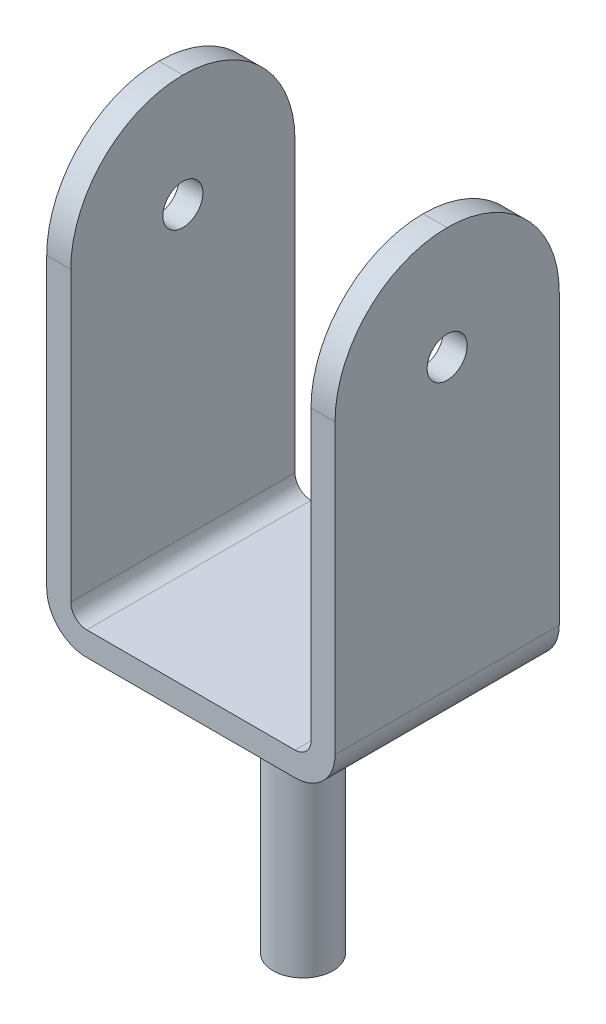
ISO-10303-21;
HEADER;
FILE_DESCRIPTION(('STEP AP214'),'2;1');
FILE_NAME('part.step','',(''),(''),'','','');
FILE_SCHEMA(('AUTOMOTIVE_DESIGN { 1 0 10303 214 1 1 1 1 }'));
ENDSEC;
DATA;
#1=APPLICATION_CONTEXT('core data for automotive mechanical design processes');
#2=APPLICATION_PROTOCOL_DEFINITION('international standard','automotive_design',2000,#1);
#3=PRODUCT_CONTEXT('',#1,'mechanical');
#4=PRODUCT('Part','Part','',(#3));
#5=PRODUCT_RELATED_PRODUCT_CATEGORY('part','',(#4));
#6=PRODUCT_DEFINITION_FORMATION('','',#4);
#7=PRODUCT_DEFINITION_CONTEXT('part definition',#1,'design');
#8=PRODUCT_DEFINITION('design','',#6,#7);
#9=PRODUCT_DEFINITION_SHAPE('','',#8);
#10=(LENGTH_UNIT() NAMED_UNIT(*) SI_UNIT(.MILLI.,.METRE.));
#11=(NAMED_UNIT(*) PLANE_ANGLE_UNIT() SI_UNIT($,.RADIAN.));
#12=(NAMED_UNIT(*) SI_UNIT($,.STERADIAN.) SOLID_ANGLE_UNIT());
#13=UNCERTAINTY_MEASURE_WITH_UNIT(LENGTH_MEASURE(1.E-05),#10,'distance_accuracy_value','');
#14=(GEOMETRIC_REPRESENTATION_CONTEXT(3) GLOBAL_UNCERTAINTY_ASSIGNED_CONTEXT((#13)) GLOBAL_UNIT_ASSIGNED_CONTEXT((#10,
#11,#12)) REPRESENTATION_CONTEXT('',''));
#15=CARTESIAN_POINT('',(0.,0.,0.));
#16=DIRECTION('',(0.,0.,1.));
#17=DIRECTION('',(1.,0.,0.));
#18=AXIS2_PLACEMENT_3D('',#15,#16,#17);
#19=CARTESIAN_POINT('',(-150.,0.,140.));
#20=DIRECTION('',(-1.,0.,0.));
#21=DIRECTION('',(0.,0.,1.));
#22=AXIS2_PLACEMENT_3D('',#19,#20,#21);
#23=PLANE('',#22);
#24=CARTESIAN_POINT('',(-150.,380.,0.));
#25=DIRECTION('',(-1.,0.,0.));
#26=DIRECTION('',(0.,0.,1.));
#27=AXIS2_PLACEMENT_3D('',#24,#25,#26);
#28=CIRCLE('',#27,25.);
#29=CARTESIAN_POINT('',(-150.,380.,-25.));
#30=VERTEX_POINT('',#29);
#31=EDGE_CURVE('E200',#30,#30,#28,.T.);
#32=ORIENTED_EDGE('',*,*,#31,.T.);
#33=EDGE_LOOP('',(#32));
#34=FACE_BOUND('',#33,.T.);
#35=DIRECTION('',(0.,1.,0.));
#36=VECTOR('',#35,1.);
#37=CARTESIAN_POINT('',(-150.,0.,140.));
#38=LINE('',#37,#36);
#39=CARTESIAN_POINT('',(-150.,20.,140.));
#40=VERTEX_POINT('',#39);
#41=CARTESIAN_POINT('',(-150.,380.,140.));
#42=VERTEX_POINT('',#41);
#43=EDGE_CURVE('E139',#40,#42,#38,.T.);
#44=ORIENTED_EDGE('',*,*,#43,.F.);
#45=DIRECTION('',(0.,0.,-1.));
#46=VECTOR('',#45,1.);
#47=CARTESIAN_POINT('',(-150.,20.,-140.));
#48=LINE('',#47,#46);
#49=CARTESIAN_POINT('',(-150.,20.,-140.));
#50=VERTEX_POINT('',#49);
#51=EDGE_CURVE('E212',#40,#50,#48,.T.);
#52=ORIENTED_EDGE('',*,*,#51,.T.);
#53=DIRECTION('',(0.,1.,0.));
#54=VECTOR('',#53,1.);
#55=CARTESIAN_POINT('',(-150.,0.,-140.));
#56=LINE('',#55,#54);
#57=CARTESIAN_POINT('',(-150.,380.,-140.));
#58=VERTEX_POINT('',#57);
#59=EDGE_CURVE('E197',#50,#58,#56,.T.);
#60=ORIENTED_EDGE('',*,*,#59,.T.);
#61=CARTESIAN_POINT('',(-150.,380.,0.));
#62=DIRECTION('',(-1.,0.,0.));
#63=DIRECTION('',(0.,0.,1.));
#64=AXIS2_PLACEMENT_3D('',#61,#62,#63);
#65=CIRCLE('',#64,140.);
#66=CARTESIAN_POINT('',(-150.,520.,0.));
#67=VERTEX_POINT('',#66);
#68=EDGE_CURVE('E156',#58,#67,#65,.F.);
#69=ORIENTED_EDGE('',*,*,#68,.T.);
#70=CARTESIAN_POINT('',(-150.,380.,0.));
#71=DIRECTION('',(-1.,0.,0.));
#72=DIRECTION('',(0.,0.,1.));
#73=AXIS2_PLACEMENT_3D('',#70,#71,#72);
#74=CIRCLE('',#73,140.);
#75=EDGE_CURVE('E154',#67,#42,#74,.F.);
#76=ORIENTED_EDGE('',*,*,#75,.T.);
#77=EDGE_LOOP('',(#44,#52,#60,#69,#76));
#78=FACE_BOUND('',#77,.T.);
#79=ADVANCED_FACE('F37',(#34,#78),#23,.F.);
#80=CARTESIAN_POINT('',(-180.,-30.,140.));
#81=DIRECTION('',(1.,0.,0.));
#82=DIRECTION('',(0.,0.,-1.));
#83=AXIS2_PLACEMENT_3D('',#80,#81,#82);
#84=PLANE('',#83);
#85=CARTESIAN_POINT('',(-180.,380.,0.));
#86=DIRECTION('',(1.,0.,0.));
#87=DIRECTION('',(0.,0.,-1.));
#88=AXIS2_PLACEMENT_3D('',#85,#86,#87);
#89=CIRCLE('',#88,25.);
#90=CARTESIAN_POINT('',(-180.,380.,-25.));
#91=VERTEX_POINT('',#90);
#92=EDGE_CURVE('E204',#91,#91,#89,.T.);
#93=ORIENTED_EDGE('',*,*,#92,.T.);
#94=EDGE_LOOP('',(#93));
#95=FACE_BOUND('',#94,.T.);
#96=DIRECTION('',(0.,-1.,0.));
#97=VECTOR('',#96,1.);
#98=CARTESIAN_POINT('',(-180.,-30.,-140.));
#99=LINE('',#98,#97);
#100=CARTESIAN_POINT('',(-180.,380.,-140.));
#101=VERTEX_POINT('',#100);
#102=CARTESIAN_POINT('',(-180.,20.,-140.));
#103=VERTEX_POINT('',#102);
#104=EDGE_CURVE('E247',#101,#103,#99,.T.);
#105=ORIENTED_EDGE('',*,*,#104,.T.);
#106=DIRECTION('',(0.,0.,-1.));
#107=VECTOR('',#106,1.);
#108=CARTESIAN_POINT('',(-180.,20.,140.));
#109=LINE('',#108,#107);
#110=CARTESIAN_POINT('',(-180.,20.,140.));
#111=VERTEX_POINT('',#110);
#112=EDGE_CURVE('E60',#103,#111,#109,.F.);
#113=ORIENTED_EDGE('',*,*,#112,.T.);
#114=DIRECTION('',(0.,-1.,0.));
#115=VECTOR('',#114,1.);
#116=CARTESIAN_POINT('',(-180.,-30.,140.));
#117=LINE('',#116,#115);
#118=CARTESIAN_POINT('',(-180.,380.,140.));
#119=VERTEX_POINT('',#118);
#120=EDGE_CURVE('E150',#119,#111,#117,.T.);
#121=ORIENTED_EDGE('',*,*,#120,.F.);
#122=CARTESIAN_POINT('',(-180.,380.,0.));
#123=DIRECTION('',(1.,0.,0.));
#124=DIRECTION('',(0.,0.,-1.));
#125=AXIS2_PLACEMENT_3D('',#122,#123,#124);
#126=CIRCLE('',#125,140.);
#127=CARTESIAN_POINT('',(-180.,520.,0.));
#128=VERTEX_POINT('',#127);
#129=EDGE_CURVE('E164',#119,#128,#126,.F.);
#130=ORIENTED_EDGE('',*,*,#129,.T.);
#131=CARTESIAN_POINT('',(-180.,380.,0.));
#132=DIRECTION('',(1.,0.,0.));
#133=DIRECTION('',(0.,0.,-1.));
#134=AXIS2_PLACEMENT_3D('',#131,#132,#133);
#135=CIRCLE('',#134,140.);
#136=EDGE_CURVE('E160',#128,#101,#135,.F.);
#137=ORIENTED_EDGE('',*,*,#136,.T.);
#138=EDGE_LOOP('',(#105,#113,#121,#130,#137));
#139=FACE_BOUND('',#138,.T.);
#140=ADVANCED_FACE('F250',(#95,#139),#84,.F.);
#141=CARTESIAN_POINT('',(-180.,-30.,140.));
#142=DIRECTION('',(0.,1.,0.));
#143=DIRECTION('',(0.,0.,1.));
#144=AXIS2_PLACEMENT_3D('',#141,#142,#143);
#145=PLANE('',#144);
#146=CARTESIAN_POINT('',(0.,-30.,0.));
#147=DIRECTION('',(0.,-1.,0.));
#148=DIRECTION('',(0.,0.,-1.));
#149=AXIS2_PLACEMENT_3D('',#146,#147,#148);
#150=CIRCLE('',#149,37.5);
#151=CARTESIAN_POINT('',(0.,-30.,-37.5));
#152=VERTEX_POINT('',#151);
#153=EDGE_CURVE('E193',#152,#152,#150,.T.);
#154=ORIENTED_EDGE('',*,*,#153,.F.);
#155=EDGE_LOOP('',(#154));
#156=FACE_BOUND('',#155,.T.);
#157=DIRECTION('',(1.,0.,0.));
#158=VECTOR('',#157,1.);
#159=CARTESIAN_POINT('',(-180.,-30.,140.));
#160=LINE('',#159,#158);
#161=CARTESIAN_POINT('',(-130.,-30.,140.));
#162=VERTEX_POINT('',#161);
#163=CARTESIAN_POINT('',(130.,-30.,140.));
#164=VERTEX_POINT('',#163);
#165=EDGE_CURVE('E233',#162,#164,#160,.T.);
#166=ORIENTED_EDGE('',*,*,#165,.F.);
#167=DIRECTION('',(0.,0.,-1.));
#168=VECTOR('',#167,1.);
#169=CARTESIAN_POINT('',(-130.,-30.,140.));
#170=LINE('',#169,#168);
#171=CARTESIAN_POINT('',(-130.,-30.,-140.));
#172=VERTEX_POINT('',#171);
#173=EDGE_CURVE('E223',#162,#172,#170,.T.);
#174=ORIENTED_EDGE('',*,*,#173,.T.);
#175=DIRECTION('',(1.,0.,0.));
#176=VECTOR('',#175,1.);
#177=CARTESIAN_POINT('',(-180.,-30.,-140.));
#178=LINE('',#177,#176);
#179=CARTESIAN_POINT('',(130.,-30.,-140.));
#180=VERTEX_POINT('',#179);
#181=EDGE_CURVE('E249',#172,#180,#178,.T.);
#182=ORIENTED_EDGE('',*,*,#181,.T.);
#183=DIRECTION('',(0.,0.,-1.));
#184=VECTOR('',#183,1.);
#185=CARTESIAN_POINT('',(130.,-30.,140.));
#186=LINE('',#185,#184);
#187=EDGE_CURVE('E221',#180,#164,#186,.F.);
#188=ORIENTED_EDGE('',*,*,#187,.T.);
#189=EDGE_LOOP('',(#166,#174,#182,#188));
#190=FACE_BOUND('',#189,.T.);
#191=ADVANCED_FACE('F237',(#156,#190),#145,.F.);
#192=CARTESIAN_POINT('',(180.,-30.,140.));
#193=DIRECTION('',(-1.,0.,0.));
#194=DIRECTION('',(0.,0.,1.));
#195=AXIS2_PLACEMENT_3D('',#192,#193,#194);
#196=PLANE('',#195);
#197=CARTESIAN_POINT('',(180.,380.,0.));
#198=DIRECTION('',(1.,0.,0.));
#199=DIRECTION('',(0.,0.,-1.));
#200=AXIS2_PLACEMENT_3D('',#197,#198,#199);
#201=CIRCLE('',#200,25.);
#202=CARTESIAN_POINT('',(180.,380.,-25.));
#203=VERTEX_POINT('',#202);
#204=EDGE_CURVE('E328',#203,#203,#201,.T.);
#205=ORIENTED_EDGE('',*,*,#204,.F.);
#206=EDGE_LOOP('',(#205));
#207=FACE_BOUND('',#206,.T.);
#208=DIRECTION('',(0.,1.,0.));
#209=VECTOR('',#208,1.);
#210=CARTESIAN_POINT('',(180.,-30.,140.));
#211=LINE('',#210,#209);
#212=CARTESIAN_POINT('',(180.,20.,140.));
#213=VERTEX_POINT('',#212);
#214=CARTESIAN_POINT('',(180.,380.,140.));
#215=VERTEX_POINT('',#214);
#216=EDGE_CURVE('E241',#213,#215,#211,.T.);
#217=ORIENTED_EDGE('',*,*,#216,.F.);
#218=DIRECTION('',(0.,0.,-1.));
#219=VECTOR('',#218,1.);
#220=CARTESIAN_POINT('',(180.,20.,140.));
#221=LINE('',#220,#219);
#222=CARTESIAN_POINT('',(180.,20.,-140.));
#223=VERTEX_POINT('',#222);
#224=EDGE_CURVE('E11',#213,#223,#221,.T.);
#225=ORIENTED_EDGE('',*,*,#224,.T.);
#226=DIRECTION('',(0.,1.,0.));
#227=VECTOR('',#226,1.);
#228=CARTESIAN_POINT('',(180.,-30.,-140.));
#229=LINE('',#228,#227);
#230=CARTESIAN_POINT('',(180.,380.,-140.));
#231=VERTEX_POINT('',#230);
#232=EDGE_CURVE('E253',#223,#231,#229,.T.);
#233=ORIENTED_EDGE('',*,*,#232,.T.);
#234=CARTESIAN_POINT('',(180.,380.,0.));
#235=DIRECTION('',(-1.,0.,0.));
#236=DIRECTION('',(0.,0.,1.));
#237=AXIS2_PLACEMENT_3D('',#234,#235,#236);
#238=CIRCLE('',#237,140.);
#239=CARTESIAN_POINT('',(180.,520.,0.));
#240=VERTEX_POINT('',#239);
#241=EDGE_CURVE('E179',#231,#240,#238,.F.);
#242=ORIENTED_EDGE('',*,*,#241,.T.);
#243=CARTESIAN_POINT('',(180.,380.,0.));
#244=DIRECTION('',(-1.,0.,0.));
#245=DIRECTION('',(0.,0.,1.));
#246=AXIS2_PLACEMENT_3D('',#243,#244,#245);
#247=CIRCLE('',#246,140.);
#248=EDGE_CURVE('E181',#240,#215,#247,.F.);
#249=ORIENTED_EDGE('',*,*,#248,.T.);
#250=EDGE_LOOP('',(#217,#225,#233,#242,#249));
#251=FACE_BOUND('',#250,.T.);
#252=ADVANCED_FACE('F314',(#207,#251),#196,.F.);
#253=CARTESIAN_POINT('',(150.,0.,140.));
#254=DIRECTION('',(1.,0.,0.));
#255=DIRECTION('',(0.,0.,-1.));
#256=AXIS2_PLACEMENT_3D('',#253,#254,#255);
#257=PLANE('',#256);
#258=CARTESIAN_POINT('',(150.,380.,0.));
#259=DIRECTION('',(1.,0.,0.));
#260=DIRECTION('',(0.,0.,-1.));
#261=AXIS2_PLACEMENT_3D('',#258,#259,#260);
#262=CIRCLE('',#261,25.);
#263=CARTESIAN_POINT('',(150.,380.,-25.));
#264=VERTEX_POINT('',#263);
#265=EDGE_CURVE('E201',#264,#264,#262,.T.);
#266=ORIENTED_EDGE('',*,*,#265,.T.);
#267=EDGE_LOOP('',(#266));
#268=FACE_BOUND('',#267,.T.);
#269=DIRECTION('',(0.,-1.,0.));
#270=VECTOR('',#269,1.);
#271=CARTESIAN_POINT('',(150.,0.,-140.));
#272=LINE('',#271,#270);
#273=CARTESIAN_POINT('',(150.,380.,-140.));
#274=VERTEX_POINT('',#273);
#275=CARTESIAN_POINT('',(150.,20.,-140.));
#276=VERTEX_POINT('',#275);
#277=EDGE_CURVE('E257',#274,#276,#272,.T.);
#278=ORIENTED_EDGE('',*,*,#277,.T.);
#279=DIRECTION('',(0.,0.,-1.));
#280=VECTOR('',#279,1.);
#281=CARTESIAN_POINT('',(150.,20.,140.));
#282=LINE('',#281,#280);
#283=CARTESIAN_POINT('',(150.,20.,140.));
#284=VERTEX_POINT('',#283);
#285=EDGE_CURVE('E210',#276,#284,#282,.F.);
#286=ORIENTED_EDGE('',*,*,#285,.T.);
#287=DIRECTION('',(0.,-1.,0.));
#288=VECTOR('',#287,1.);
#289=CARTESIAN_POINT('',(150.,0.,140.));
#290=LINE('',#289,#288);
#291=CARTESIAN_POINT('',(150.,380.,140.));
#292=VERTEX_POINT('',#291);
#293=EDGE_CURVE('E171',#292,#284,#290,.T.);
#294=ORIENTED_EDGE('',*,*,#293,.F.);
#295=CARTESIAN_POINT('',(150.,380.,0.));
#296=DIRECTION('',(1.,0.,0.));
#297=DIRECTION('',(0.,0.,-1.));
#298=AXIS2_PLACEMENT_3D('',#295,#296,#297);
#299=CIRCLE('',#298,140.);
#300=CARTESIAN_POINT('',(150.,520.,0.));
#301=VERTEX_POINT('',#300);
#302=EDGE_CURVE('E177',#292,#301,#299,.F.);
#303=ORIENTED_EDGE('',*,*,#302,.T.);
#304=CARTESIAN_POINT('',(150.,380.,0.));
#305=DIRECTION('',(1.,0.,0.));
#306=DIRECTION('',(0.,0.,-1.));
#307=AXIS2_PLACEMENT_3D('',#304,#305,#306);
#308=CIRCLE('',#307,140.);
#309=EDGE_CURVE('E169',#301,#274,#308,.F.);
#310=ORIENTED_EDGE('',*,*,#309,.T.);
#311=EDGE_LOOP('',(#278,#286,#294,#303,#310));
#312=FACE_BOUND('',#311,.T.);
#313=ADVANCED_FACE('F322',(#268,#312),#257,.F.);
#314=CARTESIAN_POINT('',(-150.,0.,140.));
#315=DIRECTION('',(0.,-1.,0.));
#316=DIRECTION('',(0.,0.,-1.));
#317=AXIS2_PLACEMENT_3D('',#314,#315,#316);
#318=PLANE('',#317);
#319=DIRECTION('',(-1.,0.,0.));
#320=VECTOR('',#319,1.);
#321=CARTESIAN_POINT('',(-150.,0.,140.));
#322=LINE('',#321,#320);
#323=CARTESIAN_POINT('',(130.,0.,140.));
#324=VERTEX_POINT('',#323);
#325=CARTESIAN_POINT('',(-130.,0.,140.));
#326=VERTEX_POINT('',#325);
#327=EDGE_CURVE('E166',#324,#326,#322,.T.);
#328=ORIENTED_EDGE('',*,*,#327,.F.);
#329=DIRECTION('',(0.,0.,-1.));
#330=VECTOR('',#329,1.);
#331=CARTESIAN_POINT('',(130.,0.,-140.));
#332=LINE('',#331,#330);
#333=CARTESIAN_POINT('',(130.,0.,-140.));
#334=VERTEX_POINT('',#333);
#335=EDGE_CURVE('E207',#324,#334,#332,.T.);
#336=ORIENTED_EDGE('',*,*,#335,.T.);
#337=DIRECTION('',(-1.,0.,0.));
#338=VECTOR('',#337,1.);
#339=CARTESIAN_POINT('',(-150.,0.,-140.));
#340=LINE('',#339,#338);
#341=CARTESIAN_POINT('',(-130.,0.,-140.));
#342=VERTEX_POINT('',#341);
#343=EDGE_CURVE('E151',#334,#342,#340,.T.);
#344=ORIENTED_EDGE('',*,*,#343,.T.);
#345=DIRECTION('',(0.,0.,-1.));
#346=VECTOR('',#345,1.);
#347=CARTESIAN_POINT('',(-130.,0.,140.));
#348=LINE('',#347,#346);
#349=EDGE_CURVE('E205',#342,#326,#348,.F.);
#350=ORIENTED_EDGE('',*,*,#349,.T.);
#351=EDGE_LOOP('',(#328,#336,#344,#350));
#352=FACE_BOUND('',#351,.T.);
#353=ADVANCED_FACE('F267',(#352),#318,.F.);
#354=CARTESIAN_POINT('',(0.,0.,140.));
#355=DIRECTION('',(0.,0.,-1.));
#356=DIRECTION('',(-1.,0.,0.));
#357=AXIS2_PLACEMENT_3D('',#354,#355,#356);
#358=PLANE('',#357);
#359=ORIENTED_EDGE('',*,*,#120,.T.);
#360=CARTESIAN_POINT('',(-130.,20.,140.));
#361=DIRECTION('',(0.,0.,-1.));
#362=DIRECTION('',(-1.,0.,0.));
#363=AXIS2_PLACEMENT_3D('',#360,#361,#362);
#364=CIRCLE('',#363,50.);
#365=EDGE_CURVE('E45',#111,#162,#364,.F.);
#366=ORIENTED_EDGE('',*,*,#365,.T.);
#367=ORIENTED_EDGE('',*,*,#165,.T.);
#368=CARTESIAN_POINT('',(130.,20.,140.));
#369=DIRECTION('',(0.,0.,-1.));
#370=DIRECTION('',(-1.,0.,0.));
#371=AXIS2_PLACEMENT_3D('',#368,#369,#370);
#372=CIRCLE('',#371,50.);
#373=EDGE_CURVE('E52',#164,#213,#372,.F.);
#374=ORIENTED_EDGE('',*,*,#373,.T.);
#375=ORIENTED_EDGE('',*,*,#216,.T.);
#376=DIRECTION('',(-1.,0.,0.));
#377=VECTOR('',#376,1.);
#378=CARTESIAN_POINT('',(0.,380.,140.));
#379=LINE('',#378,#377);
#380=EDGE_CURVE('E165',#215,#292,#379,.T.);
#381=ORIENTED_EDGE('',*,*,#380,.T.);
#382=ORIENTED_EDGE('',*,*,#293,.T.);
#383=CARTESIAN_POINT('',(130.,20.,140.));
#384=DIRECTION('',(0.,0.,-1.));
#385=DIRECTION('',(-1.,0.,0.));
#386=AXIS2_PLACEMENT_3D('',#383,#384,#385);
#387=CIRCLE('',#386,20.);
#388=EDGE_CURVE('E216',#284,#324,#387,.T.);
#389=ORIENTED_EDGE('',*,*,#388,.T.);
#390=ORIENTED_EDGE('',*,*,#327,.T.);
#391=CARTESIAN_POINT('',(-130.,20.,140.));
#392=DIRECTION('',(0.,0.,-1.));
#393=DIRECTION('',(-1.,0.,0.));
#394=AXIS2_PLACEMENT_3D('',#391,#392,#393);
#395=CIRCLE('',#394,20.);
#396=EDGE_CURVE('E146',#326,#40,#395,.T.);
#397=ORIENTED_EDGE('',*,*,#396,.T.);
#398=ORIENTED_EDGE('',*,*,#43,.T.);
#399=DIRECTION('',(-1.,0.,0.));
#400=VECTOR('',#399,1.);
#401=CARTESIAN_POINT('',(0.,380.,140.));
#402=LINE('',#401,#400);
#403=EDGE_CURVE('E143',#42,#119,#402,.T.);
#404=ORIENTED_EDGE('',*,*,#403,.T.);
#405=EDGE_LOOP('',(#359,#366,#367,#374,#375,#381,#382,#389,#390,#397,#398,#404));
#406=FACE_BOUND('',#405,.T.);
#407=ADVANCED_FACE('F141',(#406),#358,.F.);
#408=CARTESIAN_POINT('',(0.,0.,-140.));
#409=DIRECTION('',(0.,0.,-1.));
#410=DIRECTION('',(-1.,0.,0.));
#411=AXIS2_PLACEMENT_3D('',#408,#409,#410);
#412=PLANE('',#411);
#413=ORIENTED_EDGE('',*,*,#181,.F.);
#414=CARTESIAN_POINT('',(-130.,20.,-140.));
#415=DIRECTION('',(0.,0.,-1.));
#416=DIRECTION('',(-1.,0.,0.));
#417=AXIS2_PLACEMENT_3D('',#414,#415,#416);
#418=CIRCLE('',#417,50.);
#419=EDGE_CURVE('E228',#172,#103,#418,.T.);
#420=ORIENTED_EDGE('',*,*,#419,.T.);
#421=ORIENTED_EDGE('',*,*,#104,.F.);
#422=DIRECTION('',(-1.,0.,0.));
#423=VECTOR('',#422,1.);
#424=CARTESIAN_POINT('',(-150.,380.,-140.));
#425=LINE('',#424,#423);
#426=EDGE_CURVE('E184',#101,#58,#425,.F.);
#427=ORIENTED_EDGE('',*,*,#426,.T.);
#428=ORIENTED_EDGE('',*,*,#59,.F.);
#429=CARTESIAN_POINT('',(-130.,20.,-140.));
#430=DIRECTION('',(0.,0.,-1.));
#431=DIRECTION('',(-1.,0.,0.));
#432=AXIS2_PLACEMENT_3D('',#429,#430,#431);
#433=CIRCLE('',#432,20.);
#434=EDGE_CURVE('E218',#50,#342,#433,.F.);
#435=ORIENTED_EDGE('',*,*,#434,.T.);
#436=ORIENTED_EDGE('',*,*,#343,.F.);
#437=CARTESIAN_POINT('',(130.,20.,-140.));
#438=DIRECTION('',(0.,0.,-1.));
#439=DIRECTION('',(-1.,0.,0.));
#440=AXIS2_PLACEMENT_3D('',#437,#438,#439);
#441=CIRCLE('',#440,20.);
#442=EDGE_CURVE('E214',#334,#276,#441,.F.);
#443=ORIENTED_EDGE('',*,*,#442,.T.);
#444=ORIENTED_EDGE('',*,*,#277,.F.);
#445=DIRECTION('',(-1.,0.,0.));
#446=VECTOR('',#445,1.);
#447=CARTESIAN_POINT('',(180.,380.,-140.));
#448=LINE('',#447,#446);
#449=EDGE_CURVE('E187',#274,#231,#448,.F.);
#450=ORIENTED_EDGE('',*,*,#449,.T.);
#451=ORIENTED_EDGE('',*,*,#232,.F.);
#452=CARTESIAN_POINT('',(130.,20.,-140.));
#453=DIRECTION('',(0.,0.,-1.));
#454=DIRECTION('',(-1.,0.,0.));
#455=AXIS2_PLACEMENT_3D('',#452,#453,#454);
#456=CIRCLE('',#455,50.);
#457=EDGE_CURVE('E226',#223,#180,#456,.T.);
#458=ORIENTED_EDGE('',*,*,#457,.T.);
#459=EDGE_LOOP('',(#413,#420,#421,#427,#428,#435,#436,#443,#444,#450,#451,#458));
#460=FACE_BOUND('',#459,.T.);
#461=ADVANCED_FACE('F246',(#460),#412,.T.);
#462=CARTESIAN_POINT('',(150.,380.,0.));
#463=DIRECTION('',(1.,0.,0.));
#464=DIRECTION('',(0.,0.,-1.));
#465=AXIS2_PLACEMENT_3D('',#462,#463,#464);
#466=CYLINDRICAL_SURFACE('',#465,140.);
#467=DIRECTION('',(-1.,0.,0.));
#468=VECTOR('',#467,1.);
#469=CARTESIAN_POINT('',(150.,520.,0.));
#470=LINE('',#469,#468);
#471=EDGE_CURVE('E194',#240,#301,#470,.T.);
#472=ORIENTED_EDGE('',*,*,#471,.F.);
#473=ORIENTED_EDGE('',*,*,#241,.F.);
#474=ORIENTED_EDGE('',*,*,#449,.F.);
#475=ORIENTED_EDGE('',*,*,#309,.F.);
#476=EDGE_LOOP('',(#472,#473,#474,#475));
#477=FACE_BOUND('',#476,.T.);
#478=ADVANCED_FACE('F299',(#477),#466,.T.);
#479=CARTESIAN_POINT('',(0.,380.,0.));
#480=DIRECTION('',(-1.,0.,0.));
#481=DIRECTION('',(0.,0.,1.));
#482=AXIS2_PLACEMENT_3D('',#479,#480,#481);
#483=CYLINDRICAL_SURFACE('',#482,140.);
#484=ORIENTED_EDGE('',*,*,#248,.F.);
#485=ORIENTED_EDGE('',*,*,#471,.T.);
#486=ORIENTED_EDGE('',*,*,#302,.F.);
#487=ORIENTED_EDGE('',*,*,#380,.F.);
#488=EDGE_LOOP('',(#484,#485,#486,#487));
#489=FACE_BOUND('',#488,.T.);
#490=ADVANCED_FACE('F284',(#489),#483,.T.);
#491=CARTESIAN_POINT('',(0.,380.,0.));
#492=DIRECTION('',(-1.,0.,0.));
#493=DIRECTION('',(0.,0.,1.));
#494=AXIS2_PLACEMENT_3D('',#491,#492,#493);
#495=CYLINDRICAL_SURFACE('',#494,140.);
#496=ORIENTED_EDGE('',*,*,#403,.F.);
#497=ORIENTED_EDGE('',*,*,#75,.F.);
#498=DIRECTION('',(-1.,0.,0.));
#499=VECTOR('',#498,1.);
#500=CARTESIAN_POINT('',(-180.,520.,0.));
#501=LINE('',#500,#499);
#502=EDGE_CURVE('E198',#128,#67,#501,.F.);
#503=ORIENTED_EDGE('',*,*,#502,.F.);
#504=ORIENTED_EDGE('',*,*,#129,.F.);
#505=EDGE_LOOP('',(#496,#497,#503,#504));
#506=FACE_BOUND('',#505,.T.);
#507=ADVANCED_FACE('F163',(#506),#495,.T.);
#508=CARTESIAN_POINT('',(-180.,380.,0.));
#509=DIRECTION('',(1.,0.,0.));
#510=DIRECTION('',(0.,0.,-1.));
#511=AXIS2_PLACEMENT_3D('',#508,#509,#510);
#512=CYLINDRICAL_SURFACE('',#511,140.);
#513=ORIENTED_EDGE('',*,*,#68,.F.);
#514=ORIENTED_EDGE('',*,*,#426,.F.);
#515=ORIENTED_EDGE('',*,*,#136,.F.);
#516=ORIENTED_EDGE('',*,*,#502,.T.);
#517=EDGE_LOOP('',(#513,#514,#515,#516));
#518=FACE_BOUND('',#517,.T.);
#519=ADVANCED_FACE('F273',(#518),#512,.T.);
#520=CARTESIAN_POINT('',(-180.,380.,0.));
#521=DIRECTION('',(1.,0.,0.));
#522=DIRECTION('',(0.,0.,-1.));
#523=AXIS2_PLACEMENT_3D('',#520,#521,#522);
#524=CYLINDRICAL_SURFACE('',#523,25.);
#525=CARTESIAN_POINT('',(180.,380.,-25.));
#526=CARTESIAN_POINT('',(179.6875,380.,-25.));
#527=CARTESIAN_POINT('',(179.375,380.,-25.));
#528=CARTESIAN_POINT('',(178.75,380.,-25.));
#529=CARTESIAN_POINT('',(178.4375,380.,-25.));
#530=CARTESIAN_POINT('',(177.8125,380.,-25.));
#531=CARTESIAN_POINT('',(177.5,380.,-25.));
#532=CARTESIAN_POINT('',(176.875,380.,-25.));
#533=CARTESIAN_POINT('',(176.5625,380.,-25.));
#534=CARTESIAN_POINT('',(175.9375,380.,-25.));
#535=CARTESIAN_POINT('',(175.625,380.,-25.));
#536=CARTESIAN_POINT('',(175.,380.,-25.));
#537=CARTESIAN_POINT('',(174.6875,380.,-25.));
#538=CARTESIAN_POINT('',(174.0625,380.,-25.));
#539=CARTESIAN_POINT('',(173.75,380.,-25.));
#540=CARTESIAN_POINT('',(173.125,380.,-25.));
#541=CARTESIAN_POINT('',(172.8125,380.,-25.));
#542=CARTESIAN_POINT('',(172.1875,380.,-25.));
#543=CARTESIAN_POINT('',(171.875,380.,-25.));
#544=CARTESIAN_POINT('',(171.25,380.,-25.));
#545=CARTESIAN_POINT('',(170.9375,380.,-25.));
#546=CARTESIAN_POINT('',(170.3125,380.,-25.));
#547=CARTESIAN_POINT('',(170.,380.,-25.));
#548=CARTESIAN_POINT('',(169.375,380.,-25.));
#549=CARTESIAN_POINT('',(169.0625,380.,-25.));
#550=CARTESIAN_POINT('',(168.4375,380.,-25.));
#551=CARTESIAN_POINT('',(168.125,380.,-25.));
#552=CARTESIAN_POINT('',(167.5,380.,-25.));
#553=CARTESIAN_POINT('',(167.1875,380.,-25.));
#554=CARTESIAN_POINT('',(166.5625,380.,-25.));
#555=CARTESIAN_POINT('',(166.25,380.,-25.));
#556=CARTESIAN_POINT('',(165.625,380.,-25.));
#557=CARTESIAN_POINT('',(165.3125,380.,-25.));
#558=CARTESIAN_POINT('',(164.6875,380.,-25.));
#559=CARTESIAN_POINT('',(164.375,380.,-25.));
#560=CARTESIAN_POINT('',(163.75,380.,-25.));
#561=CARTESIAN_POINT('',(163.4375,380.,-25.));
#562=CARTESIAN_POINT('',(162.8125,380.,-25.));
#563=CARTESIAN_POINT('',(162.5,380.,-25.));
#564=CARTESIAN_POINT('',(161.875,380.,-25.));
#565=CARTESIAN_POINT('',(161.5625,380.,-25.));
#566=CARTESIAN_POINT('',(160.9375,380.,-25.));
#567=CARTESIAN_POINT('',(160.625,380.,-25.));
#568=CARTESIAN_POINT('',(160.,380.,-25.));
#569=CARTESIAN_POINT('',(159.6875,380.,-25.));
#570=CARTESIAN_POINT('',(159.0625,380.,-25.));
#571=CARTESIAN_POINT('',(158.75,380.,-25.));
#572=CARTESIAN_POINT('',(158.125,380.,-25.));
#573=CARTESIAN_POINT('',(157.8125,380.,-25.));
#574=CARTESIAN_POINT('',(157.1875,380.,-25.));
#575=CARTESIAN_POINT('',(156.875,380.,-25.));
#576=CARTESIAN_POINT('',(156.25,380.,-25.));
#577=CARTESIAN_POINT('',(155.9375,380.,-25.));
#578=CARTESIAN_POINT('',(155.3125,380.,-25.));
#579=CARTESIAN_POINT('',(155.,380.,-25.));
#580=CARTESIAN_POINT('',(154.375,380.,-25.));
#581=CARTESIAN_POINT('',(154.0625,380.,-25.));
#582=CARTESIAN_POINT('',(153.4375,380.,-25.));
#583=CARTESIAN_POINT('',(153.125,380.,-25.));
#584=CARTESIAN_POINT('',(152.5,380.,-25.));
#585=CARTESIAN_POINT('',(152.1875,380.,-25.));
#586=CARTESIAN_POINT('',(151.5625,380.,-25.));
#587=CARTESIAN_POINT('',(151.25,380.,-25.));
#588=CARTESIAN_POINT('',(150.625,380.,-25.));
#589=CARTESIAN_POINT('',(150.3125,380.,-25.));
#590=CARTESIAN_POINT('',(150.,380.,-25.));
#591=B_SPLINE_CURVE_WITH_KNOTS('',3,(#525,#526,#527,#528,#529,#530,#531,#532,#533,#534,#535,
#536,#537,#538,#539,#540,#541,#542,#543,#544,#545,#546,#547,#548,#549,#550,#551,#552,#553,#554,
#555,#556,#557,#558,#559,#560,#561,#562,#563,#564,#565,#566,#567,#568,#569,#570,#571,#572,#573,
#574,#575,#576,#577,#578,#579,#580,#581,#582,#583,#584,#585,#586,#587,#588,#589,#590),
.UNSPECIFIED.,.F.,.F.,(4,2,2,2,2,2,2,2,2,2,2,2,2,2,2,2,2,2,2,2,2,2,2,2,2,2,2,2,2,2,2,2,4),(0.,
0.93749999999998,1.87500000000002,2.8125,3.75000000000003,4.68750000000001,5.62499999999999,
6.56250000000003,7.50000000000001,8.43749999999999,9.37500000000002,10.3125,11.25,12.1875,
13.125,14.0625,15.,15.9375,16.875,17.8125,18.75,19.6875,20.625,21.5625,22.5,23.4375,24.375,
25.3125,26.25,27.1875,28.125,29.0625,30.),.UNSPECIFIED.);
#592=EDGE_CURVE('BSEAM275',#203,#264,#591,.T.);
#593=ORIENTED_EDGE('',*,*,#204,.T.);
#594=ORIENTED_EDGE('',*,*,#265,.F.);
#595=ORIENTED_EDGE('',*,*,#592,.T.);
#596=ORIENTED_EDGE('',*,*,#592,.F.);
#597=EDGE_LOOP('',(#593,#595,#594,#596));
#598=FACE_BOUND('',#597,.T.);
#599=ADVANCED_FACE('F275',(#598),#524,.F.);
#600=CARTESIAN_POINT('',(-180.,380.,-25.));
#601=CARTESIAN_POINT('',(-179.6875,380.,-25.));
#602=CARTESIAN_POINT('',(-179.375,380.,-25.));
#603=CARTESIAN_POINT('',(-178.75,380.,-25.));
#604=CARTESIAN_POINT('',(-178.4375,380.,-25.));
#605=CARTESIAN_POINT('',(-177.8125,380.,-25.));
#606=CARTESIAN_POINT('',(-177.5,380.,-25.));
#607=CARTESIAN_POINT('',(-176.875,380.,-25.));
#608=CARTESIAN_POINT('',(-176.5625,380.,-25.));
#609=CARTESIAN_POINT('',(-175.9375,380.,-25.));
#610=CARTESIAN_POINT('',(-175.625,380.,-25.));
#611=CARTESIAN_POINT('',(-175.,380.,-25.));
#612=CARTESIAN_POINT('',(-174.6875,380.,-25.));
#613=CARTESIAN_POINT('',(-174.0625,380.,-25.));
#614=CARTESIAN_POINT('',(-173.75,380.,-25.));
#615=CARTESIAN_POINT('',(-173.125,380.,-25.));
#616=CARTESIAN_POINT('',(-172.8125,380.,-25.));
#617=CARTESIAN_POINT('',(-172.1875,380.,-25.));
#618=CARTESIAN_POINT('',(-171.875,380.,-25.));
#619=CARTESIAN_POINT('',(-171.25,380.,-25.));
#620=CARTESIAN_POINT('',(-170.9375,380.,-25.));
#621=CARTESIAN_POINT('',(-170.3125,380.,-25.));
#622=CARTESIAN_POINT('',(-170.,380.,-25.));
#623=CARTESIAN_POINT('',(-169.375,380.,-25.));
#624=CARTESIAN_POINT('',(-169.0625,380.,-25.));
#625=CARTESIAN_POINT('',(-168.4375,380.,-25.));
#626=CARTESIAN_POINT('',(-168.125,380.,-25.));
#627=CARTESIAN_POINT('',(-167.5,380.,-25.));
#628=CARTESIAN_POINT('',(-167.1875,380.,-25.));
#629=CARTESIAN_POINT('',(-166.5625,380.,-25.));
#630=CARTESIAN_POINT('',(-166.25,380.,-25.));
#631=CARTESIAN_POINT('',(-165.625,380.,-25.));
#632=CARTESIAN_POINT('',(-165.3125,380.,-25.));
#633=CARTESIAN_POINT('',(-164.6875,380.,-25.));
#634=CARTESIAN_POINT('',(-164.375,380.,-25.));
#635=CARTESIAN_POINT('',(-163.75,380.,-25.));
#636=CARTESIAN_POINT('',(-163.4375,380.,-25.));
#637=CARTESIAN_POINT('',(-162.8125,380.,-25.));
#638=CARTESIAN_POINT('',(-162.5,380.,-25.));
#639=CARTESIAN_POINT('',(-161.875,380.,-25.));
#640=CARTESIAN_POINT('',(-161.5625,380.,-25.));
#641=CARTESIAN_POINT('',(-160.9375,380.,-25.));
#642=CARTESIAN_POINT('',(-160.625,380.,-25.));
#643=CARTESIAN_POINT('',(-160.,380.,-25.));
#644=CARTESIAN_POINT('',(-159.6875,380.,-25.));
#645=CARTESIAN_POINT('',(-159.0625,380.,-25.));
#646=CARTESIAN_POINT('',(-158.75,380.,-25.));
#647=CARTESIAN_POINT('',(-158.125,380.,-25.));
#648=CARTESIAN_POINT('',(-157.8125,380.,-25.));
#649=CARTESIAN_POINT('',(-157.1875,380.,-25.));
#650=CARTESIAN_POINT('',(-156.875,380.,-25.));
#651=CARTESIAN_POINT('',(-156.25,380.,-25.));
#652=CARTESIAN_POINT('',(-155.9375,380.,-25.));
#653=CARTESIAN_POINT('',(-155.3125,380.,-25.));
#654=CARTESIAN_POINT('',(-155.,380.,-25.));
#655=CARTESIAN_POINT('',(-154.375,380.,-25.));
#656=CARTESIAN_POINT('',(-154.0625,380.,-25.));
#657=CARTESIAN_POINT('',(-153.4375,380.,-25.));
#658=CARTESIAN_POINT('',(-153.125,380.,-25.));
#659=CARTESIAN_POINT('',(-152.5,380.,-25.));
#660=CARTESIAN_POINT('',(-152.1875,380.,-25.));
#661=CARTESIAN_POINT('',(-151.5625,380.,-25.));
#662=CARTESIAN_POINT('',(-151.25,380.,-25.));
#663=CARTESIAN_POINT('',(-150.625,380.,-25.));
#664=CARTESIAN_POINT('',(-150.3125,380.,-25.));
#665=CARTESIAN_POINT('',(-150.,380.,-25.));
#666=B_SPLINE_CURVE_WITH_KNOTS('',3,(#600,#601,#602,#603,#604,#605,#606,#607,#608,#609,#610,
#611,#612,#613,#614,#615,#616,#617,#618,#619,#620,#621,#622,#623,#624,#625,#626,#627,#628,#629,
#630,#631,#632,#633,#634,#635,#636,#637,#638,#639,#640,#641,#642,#643,#644,#645,#646,#647,#648,
#649,#650,#651,#652,#653,#654,#655,#656,#657,#658,#659,#660,#661,#662,#663,#664,#665),
.UNSPECIFIED.,.F.,.F.,(4,2,2,2,2,2,2,2,2,2,2,2,2,2,2,2,2,2,2,2,2,2,2,2,2,2,2,2,2,2,2,2,4),(0.,
0.937500000000008,1.87500000000002,2.81250000000002,3.75,4.68750000000001,5.62500000000002,
6.56250000000003,7.50000000000001,8.43750000000001,9.37500000000002,10.3125,11.25,12.1875,
13.125,14.0625,15.,15.9375,16.875,17.8125,18.75,19.6875,20.625,21.5625,22.5,23.4375,24.375,
25.3125,26.25,27.1875,28.125,29.0625,30.),.UNSPECIFIED.);
#667=EDGE_CURVE('BSEAM281',#91,#30,#666,.T.);
#668=ORIENTED_EDGE('',*,*,#92,.F.);
#669=ORIENTED_EDGE('',*,*,#31,.F.);
#670=ORIENTED_EDGE('',*,*,#667,.T.);
#671=ORIENTED_EDGE('',*,*,#667,.F.);
#672=EDGE_LOOP('',(#668,#670,#669,#671));
#673=FACE_BOUND('',#672,.T.);
#674=ADVANCED_FACE('F281',(#673),#524,.F.);
#675=CARTESIAN_POINT('',(0.,-355.,0.));
#676=DIRECTION('',(0.,1.,0.));
#677=DIRECTION('',(0.,0.,1.));
#678=AXIS2_PLACEMENT_3D('',#675,#676,#677);
#679=CYLINDRICAL_SURFACE('',#678,37.5);
#680=CARTESIAN_POINT('',(0.,-355.,0.));
#681=DIRECTION('',(0.,-1.,0.));
#682=DIRECTION('',(0.,0.,-1.));
#683=AXIS2_PLACEMENT_3D('',#680,#681,#682);
#684=CIRCLE('',#683,37.5);
#685=CARTESIAN_POINT('',(0.,-355.,-37.5));
#686=VERTEX_POINT('',#685);
#687=EDGE_CURVE('E331',#686,#686,#684,.T.);
#688=ORIENTED_EDGE('',*,*,#687,.F.);
#689=EDGE_LOOP('',(#688));
#690=FACE_BOUND('',#689,.T.);
#691=ORIENTED_EDGE('',*,*,#153,.T.);
#692=EDGE_LOOP('',(#691));
#693=FACE_BOUND('',#692,.T.);
#694=ADVANCED_FACE('F341',(#690,#693),#679,.T.);
#695=CARTESIAN_POINT('',(0.,-355.,0.));
#696=DIRECTION('',(0.,-1.,0.));
#697=DIRECTION('',(0.,0.,-1.));
#698=AXIS2_PLACEMENT_3D('',#695,#696,#697);
#699=PLANE('',#698);
#700=ORIENTED_EDGE('',*,*,#687,.T.);
#701=EDGE_LOOP('',(#700));
#702=FACE_BOUND('',#701,.T.);
#703=ADVANCED_FACE('F339',(#702),#699,.T.);
#704=CARTESIAN_POINT('',(130.,20.,140.));
#705=DIRECTION('',(0.,0.,1.));
#706=DIRECTION('',(1.,0.,0.));
#707=AXIS2_PLACEMENT_3D('',#704,#705,#706);
#708=CYLINDRICAL_SURFACE('',#707,20.);
#709=ORIENTED_EDGE('',*,*,#388,.F.);
#710=ORIENTED_EDGE('',*,*,#285,.F.);
#711=ORIENTED_EDGE('',*,*,#442,.F.);
#712=ORIENTED_EDGE('',*,*,#335,.F.);
#713=EDGE_LOOP('',(#709,#710,#711,#712));
#714=FACE_BOUND('',#713,.T.);
#715=ADVANCED_FACE('F319',(#714),#708,.F.);
#716=CARTESIAN_POINT('',(-130.,20.,140.));
#717=DIRECTION('',(0.,0.,1.));
#718=DIRECTION('',(1.,0.,0.));
#719=AXIS2_PLACEMENT_3D('',#716,#717,#718);
#720=CYLINDRICAL_SURFACE('',#719,20.);
#721=ORIENTED_EDGE('',*,*,#396,.F.);
#722=ORIENTED_EDGE('',*,*,#349,.F.);
#723=ORIENTED_EDGE('',*,*,#434,.F.);
#724=ORIENTED_EDGE('',*,*,#51,.F.);
#725=EDGE_LOOP('',(#721,#722,#723,#724));
#726=FACE_BOUND('',#725,.T.);
#727=ADVANCED_FACE('F270',(#726),#720,.F.);
#728=CARTESIAN_POINT('',(-130.,20.,140.));
#729=DIRECTION('',(0.,0.,-1.));
#730=DIRECTION('',(-1.,0.,0.));
#731=AXIS2_PLACEMENT_3D('',#728,#729,#730);
#732=CYLINDRICAL_SURFACE('',#731,50.);
#733=ORIENTED_EDGE('',*,*,#365,.F.);
#734=ORIENTED_EDGE('',*,*,#112,.F.);
#735=ORIENTED_EDGE('',*,*,#419,.F.);
#736=ORIENTED_EDGE('',*,*,#173,.F.);
#737=EDGE_LOOP('',(#733,#734,#735,#736));
#738=FACE_BOUND('',#737,.T.);
#739=ADVANCED_FACE('F243',(#738),#732,.T.);
#740=CARTESIAN_POINT('',(130.,20.,140.));
#741=DIRECTION('',(0.,0.,-1.));
#742=DIRECTION('',(-1.,0.,0.));
#743=AXIS2_PLACEMENT_3D('',#740,#741,#742);
#744=CYLINDRICAL_SURFACE('',#743,50.);
#745=ORIENTED_EDGE('',*,*,#373,.F.);
#746=ORIENTED_EDGE('',*,*,#187,.F.);
#747=ORIENTED_EDGE('',*,*,#457,.F.);
#748=ORIENTED_EDGE('',*,*,#224,.F.);
#749=EDGE_LOOP('',(#745,#746,#747,#748));
#750=FACE_BOUND('',#749,.T.);
#751=ADVANCED_FACE('F39',(#750),#744,.T.);
#752=CLOSED_SHELL('',(#79,#140,#191,#252,#313,#353,#407,#461,#478,#490,#507,#519,#599,#674,#694,
#703,#715,#727,#739,#751));
#753=MANIFOLD_SOLID_BREP('B2',#752);
#754=ADVANCED_BREP_SHAPE_REPRESENTATION('',(#18,#753),#14);
#755=SHAPE_DEFINITION_REPRESENTATION(#9,#754);
ENDSEC;
END-ISO-10303-21;
